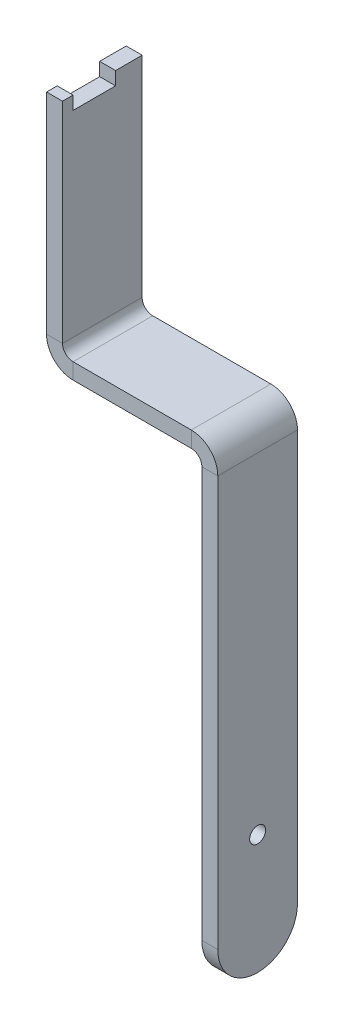
ISO-10303-21;
HEADER;
FILE_DESCRIPTION(('STEP AP214'),'2;1');
FILE_NAME('part.step','',(''),(''),'','','');
FILE_SCHEMA(('AUTOMOTIVE_DESIGN { 1 0 10303 214 1 1 1 1 }'));
ENDSEC;
DATA;
#1=APPLICATION_CONTEXT('core data for automotive mechanical design processes');
#2=APPLICATION_PROTOCOL_DEFINITION('international standard','automotive_design',2000,#1);
#3=PRODUCT_CONTEXT('',#1,'mechanical');
#4=PRODUCT('Part','Part','',(#3));
#5=PRODUCT_RELATED_PRODUCT_CATEGORY('part','',(#4));
#6=PRODUCT_DEFINITION_FORMATION('','',#4);
#7=PRODUCT_DEFINITION_CONTEXT('part definition',#1,'design');
#8=PRODUCT_DEFINITION('design','',#6,#7);
#9=PRODUCT_DEFINITION_SHAPE('','',#8);
#10=(LENGTH_UNIT() NAMED_UNIT(*) SI_UNIT(.MILLI.,.METRE.));
#11=(NAMED_UNIT(*) PLANE_ANGLE_UNIT() SI_UNIT($,.RADIAN.));
#12=(NAMED_UNIT(*) SI_UNIT($,.STERADIAN.) SOLID_ANGLE_UNIT());
#13=UNCERTAINTY_MEASURE_WITH_UNIT(LENGTH_MEASURE(1.E-05),#10,'distance_accuracy_value','');
#14=(GEOMETRIC_REPRESENTATION_CONTEXT(3) GLOBAL_UNCERTAINTY_ASSIGNED_CONTEXT((#13)) GLOBAL_UNIT_ASSIGNED_CONTEXT((#10,
#11,#12)) REPRESENTATION_CONTEXT('',''));
#15=CARTESIAN_POINT('',(0.,0.,0.));
#16=DIRECTION('',(0.,0.,1.));
#17=DIRECTION('',(1.,0.,0.));
#18=AXIS2_PLACEMENT_3D('',#15,#16,#17);
#19=CARTESIAN_POINT('',(43.0000000000001,44.5022128562178,0.));
#20=DIRECTION('',(0.,1.,0.));
#21=DIRECTION('',(0.,0.,1.));
#22=AXIS2_PLACEMENT_3D('',#19,#20,#21);
#23=PLANE('',#22);
#24=DIRECTION('',(1.,0.,0.));
#25=VECTOR('',#24,1.);
#26=CARTESIAN_POINT('',(33.0000000000001,44.5022128562179,-100.530592625912));
#27=LINE('',#26,#25);
#28=CARTESIAN_POINT('',(40.0000000000001,44.5022128562179,-100.530592625912));
#29=VERTEX_POINT('',#28);
#30=CARTESIAN_POINT('',(43.0000000000001,44.5022128562178,-100.530592625912));
#31=VERTEX_POINT('',#30);
#32=EDGE_CURVE('E217',#29,#31,#27,.T.);
#33=ORIENTED_EDGE('',*,*,#32,.T.);
#34=DIRECTION('',(0.,0.,1.));
#35=VECTOR('',#34,1.);
#36=CARTESIAN_POINT('',(43.0000000000001,44.5022128562178,0.));
#37=LINE('',#36,#35);
#38=CARTESIAN_POINT('',(43.0000000000001,44.5022128562178,-105.530592625912));
#39=VERTEX_POINT('',#38);
#40=EDGE_CURVE('E192',#39,#31,#37,.T.);
#41=ORIENTED_EDGE('',*,*,#40,.F.);
#42=DIRECTION('',(1.,0.,0.));
#43=VECTOR('',#42,1.);
#44=CARTESIAN_POINT('',(43.0000000000001,44.5022128562178,-105.530592625912));
#45=LINE('',#44,#43);
#46=CARTESIAN_POINT('',(40.0000000000001,44.5022128562179,-105.530592625912));
#47=VERTEX_POINT('',#46);
#48=EDGE_CURVE('E373',#47,#39,#45,.T.);
#49=ORIENTED_EDGE('',*,*,#48,.F.);
#50=DIRECTION('',(0.,0.,1.));
#51=VECTOR('',#50,1.);
#52=CARTESIAN_POINT('',(40.0000000000001,44.5022128562179,0.));
#53=LINE('',#52,#51);
#54=EDGE_CURVE('E208',#47,#29,#53,.T.);
#55=ORIENTED_EDGE('',*,*,#54,.T.);
#56=EDGE_LOOP('',(#33,#41,#49,#55));
#57=FACE_BOUND('',#56,.T.);
#58=ADVANCED_FACE('F51',(#57),#23,.T.);
#59=CARTESIAN_POINT('',(0.,0.,0.));
#60=DIRECTION('',(0.,1.,0.));
#61=DIRECTION('',(0.,0.,1.));
#62=AXIS2_PLACEMENT_3D('',#59,#60,#61);
#63=PLANE('',#62);
#64=DIRECTION('',(1.,0.,0.));
#65=VECTOR('',#64,1.);
#66=CARTESIAN_POINT('',(0.,0.,-90.5305926259119));
#67=LINE('',#66,#65);
#68=CARTESIAN_POINT('',(45.,0.,-90.5305926259119));
#69=VERTEX_POINT('',#68);
#70=CARTESIAN_POINT('',(67.2511064281089,0.,-90.5305926259119));
#71=VERTEX_POINT('',#70);
#72=EDGE_CURVE('E75',#69,#71,#67,.T.);
#73=ORIENTED_EDGE('',*,*,#72,.F.);
#74=DIRECTION('',(0.,0.,-1.));
#75=VECTOR('',#74,1.);
#76=CARTESIAN_POINT('',(45.,0.,0.));
#77=LINE('',#76,#75);
#78=CARTESIAN_POINT('',(45.,0.,-105.530592625912));
#79=VERTEX_POINT('',#78);
#80=EDGE_CURVE('E330',#69,#79,#77,.T.);
#81=ORIENTED_EDGE('',*,*,#80,.T.);
#82=DIRECTION('',(1.,0.,0.));
#83=VECTOR('',#82,1.);
#84=CARTESIAN_POINT('',(0.,0.,-105.530592625912));
#85=LINE('',#84,#83);
#86=CARTESIAN_POINT('',(67.2511064281089,0.,-105.530592625912));
#87=VERTEX_POINT('',#86);
#88=EDGE_CURVE('E261',#79,#87,#85,.T.);
#89=ORIENTED_EDGE('',*,*,#88,.T.);
#90=DIRECTION('',(0.,0.,-1.));
#91=VECTOR('',#90,1.);
#92=CARTESIAN_POINT('',(67.2511064281089,0.,0.));
#93=LINE('',#92,#91);
#94=EDGE_CURVE('E245',#71,#87,#93,.T.);
#95=ORIENTED_EDGE('',*,*,#94,.F.);
#96=EDGE_LOOP('',(#73,#81,#89,#95));
#97=FACE_BOUND('',#96,.T.);
#98=ADVANCED_FACE('F408',(#97),#63,.F.);
#99=CARTESIAN_POINT('',(69.2511064281092,70.7488935718911,0.));
#100=DIRECTION('',(1.,0.,0.));
#101=DIRECTION('',(0.,0.,1.));
#102=AXIS2_PLACEMENT_3D('',#99,#100,#101);
#103=PLANE('',#102);
#104=CARTESIAN_POINT('',(69.2511064281087,-64.2511064281089,-98.0305926259119));
#105=DIRECTION('',(1.,0.,0.));
#106=DIRECTION('',(0.,0.,1.));
#107=AXIS2_PLACEMENT_3D('',#104,#105,#106);
#108=CIRCLE('',#107,1.5);
#109=CARTESIAN_POINT('',(69.2511064281087,-64.2511064281089,-96.5305926259119));
#110=VERTEX_POINT('',#109);
#111=EDGE_CURVE('E256',#110,#110,#108,.T.);
#112=ORIENTED_EDGE('',*,*,#111,.T.);
#113=EDGE_LOOP('',(#112));
#114=FACE_BOUND('',#113,.T.);
#115=DIRECTION('',(0.,-1.,0.));
#116=VECTOR('',#115,1.);
#117=CARTESIAN_POINT('',(69.2511064281092,70.7488935718911,-90.5305926259119));
#118=LINE('',#117,#116);
#119=CARTESIAN_POINT('',(69.2511064281089,-2.,-90.5305926259119));
#120=VERTEX_POINT('',#119);
#121=CARTESIAN_POINT('',(69.2511064281086,-79.2511064281089,-90.5305926259119));
#122=VERTEX_POINT('',#121);
#123=EDGE_CURVE('E276',#120,#122,#118,.T.);
#124=ORIENTED_EDGE('',*,*,#123,.F.);
#125=DIRECTION('',(0.,0.,-1.));
#126=VECTOR('',#125,1.);
#127=CARTESIAN_POINT('',(69.2511064281089,-2.,0.));
#128=LINE('',#127,#126);
#129=CARTESIAN_POINT('',(69.2511064281089,-2.,-105.530592625912));
#130=VERTEX_POINT('',#129);
#131=EDGE_CURVE('E306',#120,#130,#128,.T.);
#132=ORIENTED_EDGE('',*,*,#131,.T.);
#133=DIRECTION('',(0.,-1.,0.));
#134=VECTOR('',#133,1.);
#135=CARTESIAN_POINT('',(69.2511064281092,70.7488935718911,-105.530592625912));
#136=LINE('',#135,#134);
#137=CARTESIAN_POINT('',(69.2511064281086,-79.2511064281089,-105.530592625912));
#138=VERTEX_POINT('',#137);
#139=EDGE_CURVE('E288',#130,#138,#136,.T.);
#140=ORIENTED_EDGE('',*,*,#139,.T.);
#141=CARTESIAN_POINT('',(69.2511064281086,-79.2511064281089,-98.0305926259119));
#142=DIRECTION('',(1.,0.,0.));
#143=DIRECTION('',(0.,0.,1.));
#144=AXIS2_PLACEMENT_3D('',#141,#142,#143);
#145=CIRCLE('',#144,7.5);
#146=EDGE_CURVE('E284',#138,#122,#145,.F.);
#147=ORIENTED_EDGE('',*,*,#146,.T.);
#148=EDGE_LOOP('',(#124,#132,#140,#147));
#149=FACE_BOUND('',#148,.T.);
#150=ADVANCED_FACE('F436',(#114,#149),#103,.F.);
#151=CARTESIAN_POINT('',(72.2511064281092,70.7488935718911,-90.5305926259119));
#152=DIRECTION('',(0.,0.,1.));
#153=DIRECTION('',(0.,-1.,0.));
#154=AXIS2_PLACEMENT_3D('',#151,#152,#153);
#155=PLANE('',#154);
#156=DIRECTION('',(1.,0.,0.));
#157=VECTOR('',#156,1.);
#158=CARTESIAN_POINT('',(72.2511064281089,-2.00000000000002,-90.5305926259119));
#159=LINE('',#158,#157);
#160=CARTESIAN_POINT('',(72.2511064281089,-2.00000000000002,-90.5305926259119));
#161=VERTEX_POINT('',#160);
#162=EDGE_CURVE('E310',#120,#161,#159,.T.);
#163=ORIENTED_EDGE('',*,*,#162,.F.);
#164=ORIENTED_EDGE('',*,*,#123,.T.);
#165=DIRECTION('',(1.,0.,0.));
#166=VECTOR('',#165,1.);
#167=CARTESIAN_POINT('',(72.2511064281086,-79.2511064281089,-90.5305926259119));
#168=LINE('',#167,#166);
#169=CARTESIAN_POINT('',(72.2511064281086,-79.2511064281089,-90.5305926259119));
#170=VERTEX_POINT('',#169);
#171=EDGE_CURVE('E289',#122,#170,#168,.T.);
#172=ORIENTED_EDGE('',*,*,#171,.T.);
#173=DIRECTION('',(0.,-1.,0.));
#174=VECTOR('',#173,1.);
#175=CARTESIAN_POINT('',(72.2511064281092,70.7488935718911,-90.5305926259119));
#176=LINE('',#175,#174);
#177=EDGE_CURVE('E298',#161,#170,#176,.T.);
#178=ORIENTED_EDGE('',*,*,#177,.F.);
#179=EDGE_LOOP('',(#163,#164,#172,#178));
#180=FACE_BOUND('',#179,.T.);
#181=ADVANCED_FACE('F427',(#180),#155,.T.);
#182=CARTESIAN_POINT('',(72.2511064281086,-79.2511064281089,-98.0305926259119));
#183=DIRECTION('',(1.,0.,0.));
#184=DIRECTION('',(0.,0.,1.));
#185=AXIS2_PLACEMENT_3D('',#182,#183,#184);
#186=CYLINDRICAL_SURFACE('',#185,7.5);
#187=ORIENTED_EDGE('',*,*,#171,.F.);
#188=ORIENTED_EDGE('',*,*,#146,.F.);
#189=DIRECTION('',(1.,0.,0.));
#190=VECTOR('',#189,1.);
#191=CARTESIAN_POINT('',(72.2511064281086,-79.2511064281089,-105.530592625912));
#192=LINE('',#191,#190);
#193=CARTESIAN_POINT('',(72.2511064281086,-79.2511064281089,-105.530592625912));
#194=VERTEX_POINT('',#193);
#195=EDGE_CURVE('E294',#138,#194,#192,.T.);
#196=ORIENTED_EDGE('',*,*,#195,.T.);
#197=CARTESIAN_POINT('',(72.2511064281086,-79.2511064281089,-98.0305926259119));
#198=DIRECTION('',(1.,0.,0.));
#199=DIRECTION('',(0.,0.,1.));
#200=AXIS2_PLACEMENT_3D('',#197,#198,#199);
#201=CIRCLE('',#200,7.5);
#202=EDGE_CURVE('E275',#194,#170,#201,.F.);
#203=ORIENTED_EDGE('',*,*,#202,.T.);
#204=EDGE_LOOP('',(#187,#188,#196,#203));
#205=FACE_BOUND('',#204,.T.);
#206=ADVANCED_FACE('F442',(#205),#186,.T.);
#207=CARTESIAN_POINT('',(72.2511064281087,-64.2511064281089,-98.0305926259119));
#208=DIRECTION('',(1.,0.,0.));
#209=DIRECTION('',(0.,0.,1.));
#210=AXIS2_PLACEMENT_3D('',#207,#208,#209);
#211=CYLINDRICAL_SURFACE('',#210,1.5);
#212=CARTESIAN_POINT('',(72.2511064281087,-64.2511064281089,-98.0305926259119));
#213=DIRECTION('',(1.,0.,0.));
#214=DIRECTION('',(0.,0.,1.));
#215=AXIS2_PLACEMENT_3D('',#212,#213,#214);
#216=CIRCLE('',#215,1.5);
#217=CARTESIAN_POINT('',(72.2511064281087,-64.2511064281089,-96.5305926259119));
#218=VERTEX_POINT('',#217);
#219=EDGE_CURVE('E271',#218,#218,#216,.T.);
#220=ORIENTED_EDGE('',*,*,#219,.T.);
#221=EDGE_LOOP('',(#220));
#222=FACE_BOUND('',#221,.T.);
#223=ORIENTED_EDGE('',*,*,#111,.F.);
#224=EDGE_LOOP('',(#223));
#225=FACE_BOUND('',#224,.T.);
#226=ADVANCED_FACE('F444',(#222,#225),#211,.F.);
#227=CARTESIAN_POINT('',(72.2511064281092,70.7488935718911,-105.530592625912));
#228=DIRECTION('',(0.,0.,1.));
#229=DIRECTION('',(0.,-1.,0.));
#230=AXIS2_PLACEMENT_3D('',#227,#228,#229);
#231=PLANE('',#230);
#232=DIRECTION('',(-1.,0.,0.));
#233=VECTOR('',#232,1.);
#234=CARTESIAN_POINT('',(72.2511064281089,-2.00000000000002,-105.530592625912));
#235=LINE('',#234,#233);
#236=CARTESIAN_POINT('',(72.2511064281089,-2.00000000000003,-105.530592625912));
#237=VERTEX_POINT('',#236);
#238=EDGE_CURVE('E302',#237,#130,#235,.T.);
#239=ORIENTED_EDGE('',*,*,#238,.F.);
#240=DIRECTION('',(0.,-1.,0.));
#241=VECTOR('',#240,1.);
#242=CARTESIAN_POINT('',(72.2511064281092,70.7488935718911,-105.530592625912));
#243=LINE('',#242,#241);
#244=EDGE_CURVE('E280',#237,#194,#243,.T.);
#245=ORIENTED_EDGE('',*,*,#244,.T.);
#246=ORIENTED_EDGE('',*,*,#195,.F.);
#247=ORIENTED_EDGE('',*,*,#139,.F.);
#248=EDGE_LOOP('',(#239,#245,#246,#247));
#249=FACE_BOUND('',#248,.T.);
#250=ADVANCED_FACE('F439',(#249),#231,.F.);
#251=CARTESIAN_POINT('',(72.2511064281092,70.7488935718911,0.));
#252=DIRECTION('',(1.,0.,0.));
#253=DIRECTION('',(0.,0.,1.));
#254=AXIS2_PLACEMENT_3D('',#251,#252,#253);
#255=PLANE('',#254);
#256=DIRECTION('',(0.,0.,-1.));
#257=VECTOR('',#256,1.);
#258=CARTESIAN_POINT('',(72.2511064281089,-2.00000000000002,0.));
#259=LINE('',#258,#257);
#260=EDGE_CURVE('E293',#161,#237,#259,.T.);
#261=ORIENTED_EDGE('',*,*,#260,.F.);
#262=ORIENTED_EDGE('',*,*,#177,.T.);
#263=ORIENTED_EDGE('',*,*,#202,.F.);
#264=ORIENTED_EDGE('',*,*,#244,.F.);
#265=EDGE_LOOP('',(#261,#262,#263,#264));
#266=FACE_BOUND('',#265,.T.);
#267=ORIENTED_EDGE('',*,*,#219,.F.);
#268=EDGE_LOOP('',(#267));
#269=FACE_BOUND('',#268,.T.);
#270=ADVANCED_FACE('F422',(#266,#269),#255,.T.);
#271=CARTESIAN_POINT('',(0.,3.,0.));
#272=DIRECTION('',(0.,1.,0.));
#273=DIRECTION('',(0.,0.,1.));
#274=AXIS2_PLACEMENT_3D('',#271,#272,#273);
#275=PLANE('',#274);
#276=DIRECTION('',(0.,0.,-1.));
#277=VECTOR('',#276,1.);
#278=CARTESIAN_POINT('',(45.,3.,0.));
#279=LINE('',#278,#277);
#280=CARTESIAN_POINT('',(45.,3.,-90.5305926259119));
#281=VERTEX_POINT('',#280);
#282=CARTESIAN_POINT('',(45.,3.,-105.530592625912));
#283=VERTEX_POINT('',#282);
#284=EDGE_CURVE('E314',#281,#283,#279,.T.);
#285=ORIENTED_EDGE('',*,*,#284,.F.);
#286=DIRECTION('',(1.,0.,0.));
#287=VECTOR('',#286,1.);
#288=CARTESIAN_POINT('',(0.,3.,-90.5305926259119));
#289=LINE('',#288,#287);
#290=CARTESIAN_POINT('',(67.2511064281089,3.,-90.5305926259119));
#291=VERTEX_POINT('',#290);
#292=EDGE_CURVE('E267',#281,#291,#289,.T.);
#293=ORIENTED_EDGE('',*,*,#292,.T.);
#294=DIRECTION('',(0.,0.,-1.));
#295=VECTOR('',#294,1.);
#296=CARTESIAN_POINT('',(67.2511064281089,3.,0.));
#297=LINE('',#296,#295);
#298=CARTESIAN_POINT('',(67.2511064281089,3.,-105.530592625912));
#299=VERTEX_POINT('',#298);
#300=EDGE_CURVE('E263',#291,#299,#297,.T.);
#301=ORIENTED_EDGE('',*,*,#300,.T.);
#302=DIRECTION('',(1.,0.,0.));
#303=VECTOR('',#302,1.);
#304=CARTESIAN_POINT('',(0.,3.,-105.530592625912));
#305=LINE('',#304,#303);
#306=EDGE_CURVE('E262',#283,#299,#305,.T.);
#307=ORIENTED_EDGE('',*,*,#306,.F.);
#308=EDGE_LOOP('',(#285,#293,#301,#307));
#309=FACE_BOUND('',#308,.T.);
#310=ADVANCED_FACE('F396',(#309),#275,.T.);
#311=CARTESIAN_POINT('',(0.,3.,-105.530592625912));
#312=DIRECTION('',(0.,0.,1.));
#313=DIRECTION('',(1.,0.,0.));
#314=AXIS2_PLACEMENT_3D('',#311,#312,#313);
#315=PLANE('',#314);
#316=DIRECTION('',(0.,-1.,0.));
#317=VECTOR('',#316,1.);
#318=CARTESIAN_POINT('',(45.,3.,-105.530592625912));
#319=LINE('',#318,#317);
#320=EDGE_CURVE('E326',#283,#79,#319,.T.);
#321=ORIENTED_EDGE('',*,*,#320,.F.);
#322=ORIENTED_EDGE('',*,*,#306,.T.);
#323=DIRECTION('',(0.,-1.,0.));
#324=VECTOR('',#323,1.);
#325=CARTESIAN_POINT('',(67.2511064281089,3.,-105.530592625912));
#326=LINE('',#325,#324);
#327=EDGE_CURVE('E257',#299,#87,#326,.T.);
#328=ORIENTED_EDGE('',*,*,#327,.T.);
#329=ORIENTED_EDGE('',*,*,#88,.F.);
#330=EDGE_LOOP('',(#321,#322,#328,#329));
#331=FACE_BOUND('',#330,.T.);
#332=ADVANCED_FACE('F410',(#331),#315,.F.);
#333=CARTESIAN_POINT('',(0.,3.,-90.5305926259119));
#334=DIRECTION('',(0.,0.,1.));
#335=DIRECTION('',(1.,0.,0.));
#336=AXIS2_PLACEMENT_3D('',#333,#334,#335);
#337=PLANE('',#336);
#338=DIRECTION('',(0.,1.,0.));
#339=VECTOR('',#338,1.);
#340=CARTESIAN_POINT('',(45.,3.,-90.5305926259119));
#341=LINE('',#340,#339);
#342=EDGE_CURVE('E333',#69,#281,#341,.T.);
#343=ORIENTED_EDGE('',*,*,#342,.F.);
#344=ORIENTED_EDGE('',*,*,#72,.T.);
#345=DIRECTION('',(0.,1.,0.));
#346=VECTOR('',#345,1.);
#347=CARTESIAN_POINT('',(67.2511064281089,3.,-90.5305926259119));
#348=LINE('',#347,#346);
#349=EDGE_CURVE('E252',#71,#291,#348,.T.);
#350=ORIENTED_EDGE('',*,*,#349,.T.);
#351=ORIENTED_EDGE('',*,*,#292,.F.);
#352=EDGE_LOOP('',(#343,#344,#350,#351));
#353=FACE_BOUND('',#352,.T.);
#354=ADVANCED_FACE('F53',(#353),#337,.T.);
#355=CARTESIAN_POINT('',(67.2511064281089,-2.,-90.5305926259119));
#356=DIRECTION('',(0.,0.,1.));
#357=DIRECTION('',(1.,0.,0.));
#358=AXIS2_PLACEMENT_3D('',#355,#356,#357);
#359=PLANE('',#358);
#360=ORIENTED_EDGE('',*,*,#349,.F.);
#361=CARTESIAN_POINT('',(67.2511064281089,-2.,-90.5305926259119));
#362=DIRECTION('',(0.,0.,-1.));
#363=DIRECTION('',(-1.,0.,0.));
#364=AXIS2_PLACEMENT_3D('',#361,#362,#363);
#365=CIRCLE('',#364,2.);
#366=EDGE_CURVE('E227',#71,#120,#365,.T.);
#367=ORIENTED_EDGE('',*,*,#366,.T.);
#368=ORIENTED_EDGE('',*,*,#162,.T.);
#369=CARTESIAN_POINT('',(67.2511064281089,-2.,-90.5305926259119));
#370=DIRECTION('',(0.,0.,-1.));
#371=DIRECTION('',(-1.,0.,0.));
#372=AXIS2_PLACEMENT_3D('',#369,#370,#371);
#373=CIRCLE('',#372,5.);
#374=EDGE_CURVE('E236',#291,#161,#373,.T.);
#375=ORIENTED_EDGE('',*,*,#374,.F.);
#376=EDGE_LOOP('',(#360,#367,#368,#375));
#377=FACE_BOUND('',#376,.T.);
#378=ADVANCED_FACE('F431',(#377),#359,.T.);
#379=CARTESIAN_POINT('',(67.2511064281089,-2.,-105.530592625912));
#380=DIRECTION('',(0.,0.,-1.));
#381=DIRECTION('',(-1.,0.,0.));
#382=AXIS2_PLACEMENT_3D('',#379,#380,#381);
#383=PLANE('',#382);
#384=CARTESIAN_POINT('',(67.2511064281089,-2.,-105.530592625912));
#385=DIRECTION('',(0.,0.,-1.));
#386=DIRECTION('',(-1.,0.,0.));
#387=AXIS2_PLACEMENT_3D('',#384,#385,#386);
#388=CIRCLE('',#387,2.);
#389=EDGE_CURVE('E241',#130,#87,#388,.F.);
#390=ORIENTED_EDGE('',*,*,#389,.T.);
#391=ORIENTED_EDGE('',*,*,#327,.F.);
#392=CARTESIAN_POINT('',(67.2511064281089,-2.,-105.530592625912));
#393=DIRECTION('',(0.,0.,1.));
#394=DIRECTION('',(-1.,0.,0.));
#395=AXIS2_PLACEMENT_3D('',#392,#393,#394);
#396=CIRCLE('',#395,5.);
#397=EDGE_CURVE('E240',#237,#299,#396,.T.);
#398=ORIENTED_EDGE('',*,*,#397,.F.);
#399=ORIENTED_EDGE('',*,*,#238,.T.);
#400=EDGE_LOOP('',(#390,#391,#398,#399));
#401=FACE_BOUND('',#400,.T.);
#402=ADVANCED_FACE('F414',(#401),#383,.T.);
#403=CARTESIAN_POINT('',(67.2511064281089,-2.,-81.7755729864794));
#404=DIRECTION('',(0.,0.,-1.));
#405=DIRECTION('',(-1.,0.,0.));
#406=AXIS2_PLACEMENT_3D('',#403,#404,#405);
#407=CYLINDRICAL_SURFACE('',#406,5.);
#408=ORIENTED_EDGE('',*,*,#260,.T.);
#409=ORIENTED_EDGE('',*,*,#397,.T.);
#410=ORIENTED_EDGE('',*,*,#300,.F.);
#411=ORIENTED_EDGE('',*,*,#374,.T.);
#412=EDGE_LOOP('',(#408,#409,#410,#411));
#413=FACE_BOUND('',#412,.T.);
#414=ADVANCED_FACE('F417',(#413),#407,.T.);
#415=CARTESIAN_POINT('',(67.2511064281089,-2.,-81.7755729864794));
#416=DIRECTION('',(0.,0.,-1.));
#417=DIRECTION('',(-1.,0.,0.));
#418=AXIS2_PLACEMENT_3D('',#415,#416,#417);
#419=CYLINDRICAL_SURFACE('',#418,2.);
#420=ORIENTED_EDGE('',*,*,#131,.F.);
#421=ORIENTED_EDGE('',*,*,#366,.F.);
#422=ORIENTED_EDGE('',*,*,#94,.T.);
#423=ORIENTED_EDGE('',*,*,#389,.F.);
#424=EDGE_LOOP('',(#420,#421,#422,#423));
#425=FACE_BOUND('',#424,.T.);
#426=ADVANCED_FACE('F434',(#425),#419,.F.);
#427=CARTESIAN_POINT('',(45.,5.,-90.5305926259119));
#428=DIRECTION('',(0.,0.,-1.));
#429=DIRECTION('',(-1.,0.,0.));
#430=AXIS2_PLACEMENT_3D('',#427,#428,#429);
#431=PLANE('',#430);
#432=DIRECTION('',(1.,0.,0.));
#433=VECTOR('',#432,1.);
#434=CARTESIAN_POINT('',(43.,5.,-90.5305926259119));
#435=LINE('',#434,#433);
#436=CARTESIAN_POINT('',(40.,5.00000000000002,-90.5305926259119));
#437=VERTEX_POINT('',#436);
#438=CARTESIAN_POINT('',(43.,5.00000000000001,-90.5305926259119));
#439=VERTEX_POINT('',#438);
#440=EDGE_CURVE('E232',#437,#439,#435,.T.);
#441=ORIENTED_EDGE('',*,*,#440,.F.);
#442=CARTESIAN_POINT('',(45.,5.,-90.5305926259119));
#443=DIRECTION('',(0.,0.,1.));
#444=DIRECTION('',(1.,0.,0.));
#445=AXIS2_PLACEMENT_3D('',#442,#443,#444);
#446=CIRCLE('',#445,5.);
#447=EDGE_CURVE('E228',#437,#69,#446,.T.);
#448=ORIENTED_EDGE('',*,*,#447,.T.);
#449=ORIENTED_EDGE('',*,*,#342,.T.);
#450=CARTESIAN_POINT('',(45.,5.,-90.5305926259119));
#451=DIRECTION('',(0.,0.,1.));
#452=DIRECTION('',(1.,0.,0.));
#453=AXIS2_PLACEMENT_3D('',#450,#451,#452);
#454=CIRCLE('',#453,2.);
#455=EDGE_CURVE('E218',#439,#281,#454,.T.);
#456=ORIENTED_EDGE('',*,*,#455,.F.);
#457=EDGE_LOOP('',(#441,#448,#449,#456));
#458=FACE_BOUND('',#457,.T.);
#459=ADVANCED_FACE('F401',(#458),#431,.F.);
#460=CARTESIAN_POINT('',(45.,5.,-105.530592625912));
#461=DIRECTION('',(0.,0.,1.));
#462=DIRECTION('',(1.,0.,0.));
#463=AXIS2_PLACEMENT_3D('',#460,#461,#462);
#464=PLANE('',#463);
#465=CARTESIAN_POINT('',(45.,5.,-105.530592625912));
#466=DIRECTION('',(0.,0.,1.));
#467=DIRECTION('',(1.,0.,0.));
#468=AXIS2_PLACEMENT_3D('',#465,#466,#467);
#469=CIRCLE('',#468,5.);
#470=CARTESIAN_POINT('',(40.,5.00000000000002,-105.530592625912));
#471=VERTEX_POINT('',#470);
#472=EDGE_CURVE('E223',#79,#471,#469,.F.);
#473=ORIENTED_EDGE('',*,*,#472,.T.);
#474=DIRECTION('',(-1.,0.,0.));
#475=VECTOR('',#474,1.);
#476=CARTESIAN_POINT('',(43.,5.,-105.530592625912));
#477=LINE('',#476,#475);
#478=CARTESIAN_POINT('',(43.,5.,-105.530592625912));
#479=VERTEX_POINT('',#478);
#480=EDGE_CURVE('E375',#479,#471,#477,.T.);
#481=ORIENTED_EDGE('',*,*,#480,.F.);
#482=CARTESIAN_POINT('',(45.,5.,-105.530592625912));
#483=DIRECTION('',(0.,0.,-1.));
#484=DIRECTION('',(1.,0.,0.));
#485=AXIS2_PLACEMENT_3D('',#482,#483,#484);
#486=CIRCLE('',#485,2.);
#487=EDGE_CURVE('E222',#283,#479,#486,.T.);
#488=ORIENTED_EDGE('',*,*,#487,.F.);
#489=ORIENTED_EDGE('',*,*,#320,.T.);
#490=EDGE_LOOP('',(#473,#481,#488,#489));
#491=FACE_BOUND('',#490,.T.);
#492=ADVANCED_FACE('F388',(#491),#464,.F.);
#493=CARTESIAN_POINT('',(45.,5.,-114.285612265344));
#494=DIRECTION('',(0.,0.,1.));
#495=DIRECTION('',(1.,0.,0.));
#496=AXIS2_PLACEMENT_3D('',#493,#494,#495);
#497=CYLINDRICAL_SURFACE('',#496,2.);
#498=ORIENTED_EDGE('',*,*,#284,.T.);
#499=ORIENTED_EDGE('',*,*,#487,.T.);
#500=DIRECTION('',(0.,0.,-1.));
#501=VECTOR('',#500,1.);
#502=CARTESIAN_POINT('',(43.,5.,0.));
#503=LINE('',#502,#501);
#504=EDGE_CURVE('E193',#439,#479,#503,.T.);
#505=ORIENTED_EDGE('',*,*,#504,.F.);
#506=ORIENTED_EDGE('',*,*,#455,.T.);
#507=EDGE_LOOP('',(#498,#499,#505,#506));
#508=FACE_BOUND('',#507,.T.);
#509=ADVANCED_FACE('F392',(#508),#497,.F.);
#510=CARTESIAN_POINT('',(45.,5.,-114.285612265344));
#511=DIRECTION('',(0.,0.,1.));
#512=DIRECTION('',(1.,0.,0.));
#513=AXIS2_PLACEMENT_3D('',#510,#511,#512);
#514=CYLINDRICAL_SURFACE('',#513,5.);
#515=ORIENTED_EDGE('',*,*,#80,.F.);
#516=ORIENTED_EDGE('',*,*,#447,.F.);
#517=DIRECTION('',(0.,0.,-1.));
#518=VECTOR('',#517,1.);
#519=CARTESIAN_POINT('',(40.,5.00000000000002,0.));
#520=LINE('',#519,#518);
#521=EDGE_CURVE('E213',#437,#471,#520,.T.);
#522=ORIENTED_EDGE('',*,*,#521,.T.);
#523=ORIENTED_EDGE('',*,*,#472,.F.);
#524=EDGE_LOOP('',(#515,#516,#522,#523));
#525=FACE_BOUND('',#524,.T.);
#526=ADVANCED_FACE('F407',(#525),#514,.T.);
#527=DIRECTION('',(1.,0.,0.));
#528=VECTOR('',#527,1.);
#529=CARTESIAN_POINT('',(33.0000000000001,44.5022128562179,-92.5305926259119));
#530=LINE('',#529,#528);
#531=CARTESIAN_POINT('',(40.0000000000001,44.5022128562179,-92.5305926259119));
#532=VERTEX_POINT('',#531);
#533=CARTESIAN_POINT('',(43.0000000000001,44.5022128562178,-92.5305926259119));
#534=VERTEX_POINT('',#533);
#535=EDGE_CURVE('E164',#532,#534,#530,.T.);
#536=ORIENTED_EDGE('',*,*,#535,.F.);
#537=CARTESIAN_POINT('',(40.0000000000001,44.5022128562179,-90.5305926259119));
#538=VERTEX_POINT('',#537);
#539=EDGE_CURVE('E212',#532,#538,#53,.T.);
#540=ORIENTED_EDGE('',*,*,#539,.T.);
#541=DIRECTION('',(1.,0.,0.));
#542=VECTOR('',#541,1.);
#543=CARTESIAN_POINT('',(43.0000000000001,44.5022128562178,-90.5305926259119));
#544=LINE('',#543,#542);
#545=CARTESIAN_POINT('',(43.0000000000001,44.5022128562178,-90.5305926259119));
#546=VERTEX_POINT('',#545);
#547=EDGE_CURVE('E189',#538,#546,#544,.T.);
#548=ORIENTED_EDGE('',*,*,#547,.T.);
#549=EDGE_CURVE('E181',#534,#546,#37,.T.);
#550=ORIENTED_EDGE('',*,*,#549,.F.);
#551=EDGE_LOOP('',(#536,#540,#548,#550));
#552=FACE_BOUND('',#551,.T.);
#553=ADVANCED_FACE('F187',(#552),#23,.T.);
#554=CARTESIAN_POINT('',(43.0000000000001,44.5022128562178,0.));
#555=DIRECTION('',(1.,0.,0.));
#556=DIRECTION('',(0.,0.,1.));
#557=AXIS2_PLACEMENT_3D('',#554,#555,#556);
#558=PLANE('',#557);
#559=DIRECTION('',(0.,1.,0.));
#560=VECTOR('',#559,1.);
#561=CARTESIAN_POINT('',(43.0000000000001,44.5022128562178,-100.530592625912));
#562=LINE('',#561,#560);
#563=CARTESIAN_POINT('',(43.0000000000001,42.0022128562178,-100.530592625912));
#564=VERTEX_POINT('',#563);
#565=EDGE_CURVE('E175',#564,#31,#562,.T.);
#566=ORIENTED_EDGE('',*,*,#565,.F.);
#567=DIRECTION('',(0.,0.,-1.));
#568=VECTOR('',#567,1.);
#569=CARTESIAN_POINT('',(43.0000000000001,42.0022128562178,-100.530592625912));
#570=LINE('',#569,#568);
#571=CARTESIAN_POINT('',(43.0000000000001,42.0022128562178,-92.5305926259119));
#572=VERTEX_POINT('',#571);
#573=EDGE_CURVE('E184',#572,#564,#570,.T.);
#574=ORIENTED_EDGE('',*,*,#573,.F.);
#575=DIRECTION('',(0.,-1.,0.));
#576=VECTOR('',#575,1.);
#577=CARTESIAN_POINT('',(43.0000000000001,42.0022128562178,-92.5305926259119));
#578=LINE('',#577,#576);
#579=EDGE_CURVE('E167',#534,#572,#578,.T.);
#580=ORIENTED_EDGE('',*,*,#579,.F.);
#581=ORIENTED_EDGE('',*,*,#549,.T.);
#582=DIRECTION('',(0.,-1.,0.));
#583=VECTOR('',#582,1.);
#584=CARTESIAN_POINT('',(43.0000000000001,44.5022128562179,-90.5305926259119));
#585=LINE('',#584,#583);
#586=EDGE_CURVE('E199',#546,#439,#585,.T.);
#587=ORIENTED_EDGE('',*,*,#586,.T.);
#588=ORIENTED_EDGE('',*,*,#504,.T.);
#589=DIRECTION('',(0.,-1.,0.));
#590=VECTOR('',#589,1.);
#591=CARTESIAN_POINT('',(43.0000000000001,44.5022128562179,-105.530592625912));
#592=LINE('',#591,#590);
#593=EDGE_CURVE('E198',#39,#479,#592,.T.);
#594=ORIENTED_EDGE('',*,*,#593,.F.);
#595=ORIENTED_EDGE('',*,*,#40,.T.);
#596=EDGE_LOOP('',(#566,#574,#580,#581,#587,#588,#594,#595));
#597=FACE_BOUND('',#596,.T.);
#598=ADVANCED_FACE('F179',(#597),#558,.T.);
#599=CARTESIAN_POINT('',(43.0000000000001,44.5022128562179,-105.530592625912));
#600=DIRECTION('',(0.,0.,1.));
#601=DIRECTION('',(0.,-1.,0.));
#602=AXIS2_PLACEMENT_3D('',#599,#600,#601);
#603=PLANE('',#602);
#604=ORIENTED_EDGE('',*,*,#593,.T.);
#605=ORIENTED_EDGE('',*,*,#480,.T.);
#606=DIRECTION('',(0.,-1.,0.));
#607=VECTOR('',#606,1.);
#608=CARTESIAN_POINT('',(40.0000000000001,44.5022128562179,-105.530592625912));
#609=LINE('',#608,#607);
#610=EDGE_CURVE('E370',#47,#471,#609,.T.);
#611=ORIENTED_EDGE('',*,*,#610,.F.);
#612=ORIENTED_EDGE('',*,*,#48,.T.);
#613=EDGE_LOOP('',(#604,#605,#611,#612));
#614=FACE_BOUND('',#613,.T.);
#615=ADVANCED_FACE('F384',(#614),#603,.F.);
#616=CARTESIAN_POINT('',(40.0000000000001,44.5022128562179,0.));
#617=DIRECTION('',(1.,0.,0.));
#618=DIRECTION('',(0.,0.,1.));
#619=AXIS2_PLACEMENT_3D('',#616,#617,#618);
#620=PLANE('',#619);
#621=DIRECTION('',(0.,0.,-1.));
#622=VECTOR('',#621,1.);
#623=CARTESIAN_POINT('',(40.0000000000001,42.0022128562179,0.));
#624=LINE('',#623,#622);
#625=CARTESIAN_POINT('',(40.0000000000001,42.0022128562178,-92.5305926259119));
#626=VERTEX_POINT('',#625);
#627=CARTESIAN_POINT('',(40.0000000000001,42.0022128562179,-100.530592625912));
#628=VERTEX_POINT('',#627);
#629=EDGE_CURVE('E60',#626,#628,#624,.T.);
#630=ORIENTED_EDGE('',*,*,#629,.T.);
#631=DIRECTION('',(0.,1.,0.));
#632=VECTOR('',#631,1.);
#633=CARTESIAN_POINT('',(40.0000000000001,44.5022128562179,-100.530592625912));
#634=LINE('',#633,#632);
#635=EDGE_CURVE('E12',#628,#29,#634,.T.);
#636=ORIENTED_EDGE('',*,*,#635,.T.);
#637=ORIENTED_EDGE('',*,*,#54,.F.);
#638=ORIENTED_EDGE('',*,*,#610,.T.);
#639=ORIENTED_EDGE('',*,*,#521,.F.);
#640=DIRECTION('',(0.,-1.,0.));
#641=VECTOR('',#640,1.);
#642=CARTESIAN_POINT('',(40.0000000000001,44.5022128562179,-90.5305926259119));
#643=LINE('',#642,#641);
#644=EDGE_CURVE('E367',#538,#437,#643,.T.);
#645=ORIENTED_EDGE('',*,*,#644,.F.);
#646=ORIENTED_EDGE('',*,*,#539,.F.);
#647=DIRECTION('',(0.,-1.,0.));
#648=VECTOR('',#647,1.);
#649=CARTESIAN_POINT('',(40.0000000000001,44.5022128562179,-92.5305926259119));
#650=LINE('',#649,#648);
#651=EDGE_CURVE('E170',#532,#626,#650,.T.);
#652=ORIENTED_EDGE('',*,*,#651,.T.);
#653=EDGE_LOOP('',(#630,#636,#637,#638,#639,#645,#646,#652));
#654=FACE_BOUND('',#653,.T.);
#655=ADVANCED_FACE('F349',(#654),#620,.F.);
#656=CARTESIAN_POINT('',(43.0000000000001,44.5022128562179,-90.5305926259119));
#657=DIRECTION('',(0.,0.,1.));
#658=DIRECTION('',(0.,-1.,0.));
#659=AXIS2_PLACEMENT_3D('',#656,#657,#658);
#660=PLANE('',#659);
#661=ORIENTED_EDGE('',*,*,#644,.T.);
#662=ORIENTED_EDGE('',*,*,#440,.T.);
#663=ORIENTED_EDGE('',*,*,#586,.F.);
#664=ORIENTED_EDGE('',*,*,#547,.F.);
#665=EDGE_LOOP('',(#661,#662,#663,#664));
#666=FACE_BOUND('',#665,.T.);
#667=ADVANCED_FACE('F535',(#666),#660,.T.);
#668=CARTESIAN_POINT('',(33.0000000000001,44.5022128562179,-100.530592625912));
#669=DIRECTION('',(0.,0.,-1.));
#670=DIRECTION('',(-1.,0.,0.));
#671=AXIS2_PLACEMENT_3D('',#668,#669,#670);
#672=PLANE('',#671);
#673=DIRECTION('',(1.,0.,0.));
#674=VECTOR('',#673,1.);
#675=CARTESIAN_POINT('',(33.0000000000001,42.0022128562179,-100.530592625912));
#676=LINE('',#675,#674);
#677=EDGE_CURVE('E354',#628,#564,#676,.T.);
#678=ORIENTED_EDGE('',*,*,#677,.T.);
#679=ORIENTED_EDGE('',*,*,#565,.T.);
#680=ORIENTED_EDGE('',*,*,#32,.F.);
#681=ORIENTED_EDGE('',*,*,#635,.F.);
#682=EDGE_LOOP('',(#678,#679,#680,#681));
#683=FACE_BOUND('',#682,.T.);
#684=ADVANCED_FACE('F539',(#683),#672,.F.);
#685=CARTESIAN_POINT('',(33.0000000000001,42.0022128562179,-100.530592625912));
#686=DIRECTION('',(0.,-1.,0.));
#687=DIRECTION('',(1.,0.,0.));
#688=AXIS2_PLACEMENT_3D('',#685,#686,#687);
#689=PLANE('',#688);
#690=DIRECTION('',(1.,0.,0.));
#691=VECTOR('',#690,1.);
#692=CARTESIAN_POINT('',(33.0000000000001,42.0022128562179,-92.5305926259119));
#693=LINE('',#692,#691);
#694=EDGE_CURVE('E67',#626,#572,#693,.T.);
#695=ORIENTED_EDGE('',*,*,#694,.T.);
#696=ORIENTED_EDGE('',*,*,#573,.T.);
#697=ORIENTED_EDGE('',*,*,#677,.F.);
#698=ORIENTED_EDGE('',*,*,#629,.F.);
#699=EDGE_LOOP('',(#695,#696,#697,#698));
#700=FACE_BOUND('',#699,.T.);
#701=ADVANCED_FACE('F353',(#700),#689,.F.);
#702=CARTESIAN_POINT('',(33.0000000000001,42.0022128562179,-92.5305926259119));
#703=DIRECTION('',(0.,0.,1.));
#704=DIRECTION('',(1.,0.,0.));
#705=AXIS2_PLACEMENT_3D('',#702,#703,#704);
#706=PLANE('',#705);
#707=ORIENTED_EDGE('',*,*,#535,.T.);
#708=ORIENTED_EDGE('',*,*,#579,.T.);
#709=ORIENTED_EDGE('',*,*,#694,.F.);
#710=ORIENTED_EDGE('',*,*,#651,.F.);
#711=EDGE_LOOP('',(#707,#708,#709,#710));
#712=FACE_BOUND('',#711,.T.);
#713=ADVANCED_FACE('F166',(#712),#706,.F.);
#714=CLOSED_SHELL('',(#58,#98,#150,#181,#206,#226,#250,#270,#310,#332,#354,#378,#402,#414,#426,
#459,#492,#509,#526,#553,#598,#615,#655,#667,#684,#701,#713));
#715=MANIFOLD_SOLID_BREP('B2',#714);
#716=ADVANCED_BREP_SHAPE_REPRESENTATION('',(#18,#715),#14);
#717=SHAPE_DEFINITION_REPRESENTATION(#9,#716);
ENDSEC;
END-ISO-10303-21;
